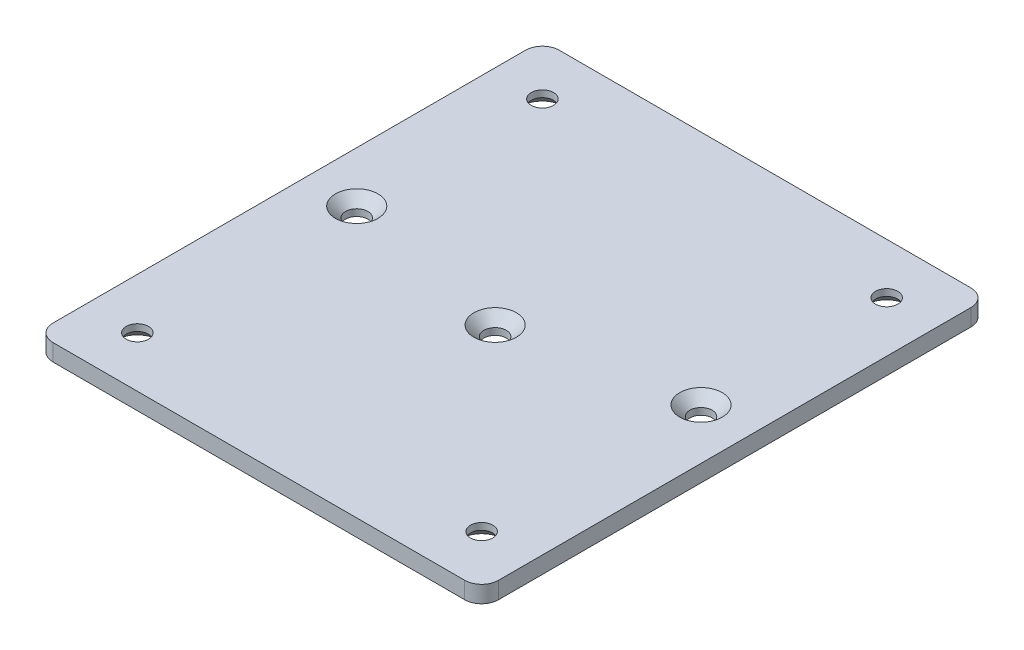
ISO-10303-21;
HEADER;
FILE_DESCRIPTION(('STEP AP214'),'2;1');
FILE_NAME('part.step','',(''),(''),'','','');
FILE_SCHEMA(('AUTOMOTIVE_DESIGN { 1 0 10303 214 1 1 1 1 }'));
ENDSEC;
DATA;
#1=APPLICATION_CONTEXT('core data for automotive mechanical design processes');
#2=APPLICATION_PROTOCOL_DEFINITION('international standard','automotive_design',2000,#1);
#3=PRODUCT_CONTEXT('',#1,'mechanical');
#4=PRODUCT('Part','Part','',(#3));
#5=PRODUCT_RELATED_PRODUCT_CATEGORY('part','',(#4));
#6=PRODUCT_DEFINITION_FORMATION('','',#4);
#7=PRODUCT_DEFINITION_CONTEXT('part definition',#1,'design');
#8=PRODUCT_DEFINITION('design','',#6,#7);
#9=PRODUCT_DEFINITION_SHAPE('','',#8);
#10=(LENGTH_UNIT() NAMED_UNIT(*) SI_UNIT(.MILLI.,.METRE.));
#11=(NAMED_UNIT(*) PLANE_ANGLE_UNIT() SI_UNIT($,.RADIAN.));
#12=(NAMED_UNIT(*) SI_UNIT($,.STERADIAN.) SOLID_ANGLE_UNIT());
#13=UNCERTAINTY_MEASURE_WITH_UNIT(LENGTH_MEASURE(1.E-05),#10,'distance_accuracy_value','');
#14=(GEOMETRIC_REPRESENTATION_CONTEXT(3) GLOBAL_UNCERTAINTY_ASSIGNED_CONTEXT((#13)) GLOBAL_UNIT_ASSIGNED_CONTEXT((#10,
#11,#12)) REPRESENTATION_CONTEXT('',''));
#15=CARTESIAN_POINT('',(0.,0.,0.));
#16=DIRECTION('',(0.,0.,1.));
#17=DIRECTION('',(1.,0.,0.));
#18=AXIS2_PLACEMENT_3D('',#15,#16,#17);
#19=CARTESIAN_POINT('',(0.,5.,0.));
#20=DIRECTION('',(1.,0.,0.));
#21=DIRECTION('',(0.,0.,-1.));
#22=AXIS2_PLACEMENT_3D('',#19,#20,#21);
#23=PLANE('',#22);
#24=DIRECTION('',(0.,0.,1.));
#25=VECTOR('',#24,1.);
#26=CARTESIAN_POINT('',(0.,0.,0.));
#27=LINE('',#26,#25);
#28=CARTESIAN_POINT('',(0.,0.,-145.));
#29=VERTEX_POINT('',#28);
#30=CARTESIAN_POINT('',(0.,0.,-5.));
#31=VERTEX_POINT('',#30);
#32=EDGE_CURVE('E138',#29,#31,#27,.T.);
#33=ORIENTED_EDGE('',*,*,#32,.T.);
#34=DIRECTION('',(0.,-1.,0.));
#35=VECTOR('',#34,1.);
#36=CARTESIAN_POINT('',(0.,5.,-5.));
#37=LINE('',#36,#35);
#38=CARTESIAN_POINT('',(0.,5.,-5.));
#39=VERTEX_POINT('',#38);
#40=EDGE_CURVE('E11',#31,#39,#37,.F.);
#41=ORIENTED_EDGE('',*,*,#40,.T.);
#42=DIRECTION('',(0.,0.,1.));
#43=VECTOR('',#42,1.);
#44=CARTESIAN_POINT('',(0.,5.,0.));
#45=LINE('',#44,#43);
#46=CARTESIAN_POINT('',(0.,5.,-145.));
#47=VERTEX_POINT('',#46);
#48=EDGE_CURVE('E126',#47,#39,#45,.T.);
#49=ORIENTED_EDGE('',*,*,#48,.F.);
#50=DIRECTION('',(0.,-1.,0.));
#51=VECTOR('',#50,1.);
#52=CARTESIAN_POINT('',(0.,5.,-145.));
#53=LINE('',#52,#51);
#54=EDGE_CURVE('E42',#47,#29,#53,.T.);
#55=ORIENTED_EDGE('',*,*,#54,.T.);
#56=EDGE_LOOP('',(#33,#41,#49,#55));
#57=FACE_BOUND('',#56,.T.);
#58=ADVANCED_FACE('F34',(#57),#23,.F.);
#59=CARTESIAN_POINT('',(0.,5.,0.));
#60=DIRECTION('',(0.,0.,-1.));
#61=DIRECTION('',(-1.,0.,0.));
#62=AXIS2_PLACEMENT_3D('',#59,#60,#61);
#63=PLANE('',#62);
#64=DIRECTION('',(1.,0.,0.));
#65=VECTOR('',#64,1.);
#66=CARTESIAN_POINT('',(0.,0.,0.));
#67=LINE('',#66,#65);
#68=CARTESIAN_POINT('',(5.,0.,0.));
#69=VERTEX_POINT('',#68);
#70=CARTESIAN_POINT('',(127.,0.,0.));
#71=VERTEX_POINT('',#70);
#72=EDGE_CURVE('E131',#69,#71,#67,.T.);
#73=ORIENTED_EDGE('',*,*,#72,.T.);
#74=DIRECTION('',(0.,-1.,0.));
#75=VECTOR('',#74,1.);
#76=CARTESIAN_POINT('',(127.,5.,0.));
#77=LINE('',#76,#75);
#78=CARTESIAN_POINT('',(127.,5.,0.));
#79=VERTEX_POINT('',#78);
#80=EDGE_CURVE('E49',#71,#79,#77,.F.);
#81=ORIENTED_EDGE('',*,*,#80,.T.);
#82=DIRECTION('',(1.,0.,0.));
#83=VECTOR('',#82,1.);
#84=CARTESIAN_POINT('',(0.,5.,0.));
#85=LINE('',#84,#83);
#86=CARTESIAN_POINT('',(5.,5.,0.));
#87=VERTEX_POINT('',#86);
#88=EDGE_CURVE('E129',#87,#79,#85,.T.);
#89=ORIENTED_EDGE('',*,*,#88,.F.);
#90=DIRECTION('',(0.,-1.,0.));
#91=VECTOR('',#90,1.);
#92=CARTESIAN_POINT('',(5.,5.,0.));
#93=LINE('',#92,#91);
#94=EDGE_CURVE('E185',#87,#69,#93,.T.);
#95=ORIENTED_EDGE('',*,*,#94,.T.);
#96=EDGE_LOOP('',(#73,#81,#89,#95));
#97=FACE_BOUND('',#96,.T.);
#98=ADVANCED_FACE('F275',(#97),#63,.F.);
#99=CARTESIAN_POINT('',(132.,5.,0.));
#100=DIRECTION('',(-1.,0.,0.));
#101=DIRECTION('',(0.,0.,1.));
#102=AXIS2_PLACEMENT_3D('',#99,#100,#101);
#103=PLANE('',#102);
#104=DIRECTION('',(0.,0.,-1.));
#105=VECTOR('',#104,1.);
#106=CARTESIAN_POINT('',(132.,0.,0.));
#107=LINE('',#106,#105);
#108=CARTESIAN_POINT('',(132.,0.,-5.));
#109=VERTEX_POINT('',#108);
#110=CARTESIAN_POINT('',(132.,0.,-145.));
#111=VERTEX_POINT('',#110);
#112=EDGE_CURVE('E127',#109,#111,#107,.T.);
#113=ORIENTED_EDGE('',*,*,#112,.T.);
#114=DIRECTION('',(0.,-1.,0.));
#115=VECTOR('',#114,1.);
#116=CARTESIAN_POINT('',(132.,5.,-145.));
#117=LINE('',#116,#115);
#118=CARTESIAN_POINT('',(132.,5.,-145.));
#119=VERTEX_POINT('',#118);
#120=EDGE_CURVE('E105',#111,#119,#117,.F.);
#121=ORIENTED_EDGE('',*,*,#120,.T.);
#122=DIRECTION('',(0.,0.,-1.));
#123=VECTOR('',#122,1.);
#124=CARTESIAN_POINT('',(132.,5.,0.));
#125=LINE('',#124,#123);
#126=CARTESIAN_POINT('',(132.,5.,-5.));
#127=VERTEX_POINT('',#126);
#128=EDGE_CURVE('E200',#127,#119,#125,.T.);
#129=ORIENTED_EDGE('',*,*,#128,.F.);
#130=DIRECTION('',(0.,-1.,0.));
#131=VECTOR('',#130,1.);
#132=CARTESIAN_POINT('',(132.,5.,-5.));
#133=LINE('',#132,#131);
#134=EDGE_CURVE('E110',#127,#109,#133,.T.);
#135=ORIENTED_EDGE('',*,*,#134,.T.);
#136=EDGE_LOOP('',(#113,#121,#129,#135));
#137=FACE_BOUND('',#136,.T.);
#138=ADVANCED_FACE('F272',(#137),#103,.F.);
#139=CARTESIAN_POINT('',(0.,5.,-150.));
#140=DIRECTION('',(0.,0.,1.));
#141=DIRECTION('',(1.,0.,0.));
#142=AXIS2_PLACEMENT_3D('',#139,#140,#141);
#143=PLANE('',#142);
#144=DIRECTION('',(-1.,0.,0.));
#145=VECTOR('',#144,1.);
#146=CARTESIAN_POINT('',(0.,5.,-150.));
#147=LINE('',#146,#145);
#148=CARTESIAN_POINT('',(127.,5.,-150.));
#149=VERTEX_POINT('',#148);
#150=CARTESIAN_POINT('',(5.,5.,-150.));
#151=VERTEX_POINT('',#150);
#152=EDGE_CURVE('E120',#149,#151,#147,.T.);
#153=ORIENTED_EDGE('',*,*,#152,.F.);
#154=DIRECTION('',(0.,-1.,0.));
#155=VECTOR('',#154,1.);
#156=CARTESIAN_POINT('',(127.,5.,-150.));
#157=LINE('',#156,#155);
#158=CARTESIAN_POINT('',(127.,0.,-150.));
#159=VERTEX_POINT('',#158);
#160=EDGE_CURVE('E104',#149,#159,#157,.T.);
#161=ORIENTED_EDGE('',*,*,#160,.T.);
#162=DIRECTION('',(-1.,0.,0.));
#163=VECTOR('',#162,1.);
#164=CARTESIAN_POINT('',(0.,0.,-150.));
#165=LINE('',#164,#163);
#166=CARTESIAN_POINT('',(5.,0.,-150.));
#167=VERTEX_POINT('',#166);
#168=EDGE_CURVE('E117',#159,#167,#165,.T.);
#169=ORIENTED_EDGE('',*,*,#168,.T.);
#170=DIRECTION('',(0.,-1.,0.));
#171=VECTOR('',#170,1.);
#172=CARTESIAN_POINT('',(5.,5.,-150.));
#173=LINE('',#172,#171);
#174=EDGE_CURVE('E122',#167,#151,#173,.F.);
#175=ORIENTED_EDGE('',*,*,#174,.T.);
#176=EDGE_LOOP('',(#153,#161,#169,#175));
#177=FACE_BOUND('',#176,.T.);
#178=ADVANCED_FACE('F116',(#177),#143,.F.);
#179=CARTESIAN_POINT('',(0.,5.,0.));
#180=DIRECTION('',(0.,-1.,0.));
#181=DIRECTION('',(0.,0.,-1.));
#182=AXIS2_PLACEMENT_3D('',#179,#180,#181);
#183=PLANE('',#182);
#184=CARTESIAN_POINT('',(15.,5.,-15.));
#185=DIRECTION('',(0.,-1.,0.));
#186=DIRECTION('',(0.,0.,-1.));
#187=AXIS2_PLACEMENT_3D('',#184,#185,#186);
#188=CIRCLE('',#187,3.29999999999999);
#189=CARTESIAN_POINT('',(15.,5.,-18.3));
#190=VERTEX_POINT('',#189);
#191=EDGE_CURVE('E165',#190,#190,#188,.T.);
#192=ORIENTED_EDGE('',*,*,#191,.T.);
#193=EDGE_LOOP('',(#192));
#194=FACE_BOUND('',#193,.T.);
#195=CARTESIAN_POINT('',(117.,5.,-15.));
#196=DIRECTION('',(0.,-1.,0.));
#197=DIRECTION('',(0.,0.,-1.));
#198=AXIS2_PLACEMENT_3D('',#195,#196,#197);
#199=CIRCLE('',#198,3.29999999999998);
#200=CARTESIAN_POINT('',(117.,5.,-18.3));
#201=VERTEX_POINT('',#200);
#202=EDGE_CURVE('E160',#201,#201,#199,.T.);
#203=ORIENTED_EDGE('',*,*,#202,.T.);
#204=EDGE_LOOP('',(#203));
#205=FACE_BOUND('',#204,.T.);
#206=CARTESIAN_POINT('',(117.,5.,-135.));
#207=DIRECTION('',(0.,-1.,0.));
#208=DIRECTION('',(0.,0.,-1.));
#209=AXIS2_PLACEMENT_3D('',#206,#207,#208);
#210=CIRCLE('',#209,3.29999999999998);
#211=CARTESIAN_POINT('',(117.,5.,-138.3));
#212=VERTEX_POINT('',#211);
#213=EDGE_CURVE('E155',#212,#212,#210,.T.);
#214=ORIENTED_EDGE('',*,*,#213,.T.);
#215=EDGE_LOOP('',(#214));
#216=FACE_BOUND('',#215,.T.);
#217=CARTESIAN_POINT('',(15.,5.,-135.));
#218=DIRECTION('',(0.,-1.,0.));
#219=DIRECTION('',(0.,0.,-1.));
#220=AXIS2_PLACEMENT_3D('',#217,#218,#219);
#221=CIRCLE('',#220,3.29999999999999);
#222=CARTESIAN_POINT('',(15.,5.,-138.3));
#223=VERTEX_POINT('',#222);
#224=EDGE_CURVE('E150',#223,#223,#221,.T.);
#225=ORIENTED_EDGE('',*,*,#224,.T.);
#226=EDGE_LOOP('',(#225));
#227=FACE_BOUND('',#226,.T.);
#228=CARTESIAN_POINT('',(15.,5.,-80.));
#229=DIRECTION('',(0.,1.,0.));
#230=DIRECTION('',(0.,0.,1.));
#231=AXIS2_PLACEMENT_3D('',#228,#229,#230);
#232=CIRCLE('',#231,6.3);
#233=CARTESIAN_POINT('',(15.,5.,-73.7));
#234=VERTEX_POINT('',#233);
#235=EDGE_CURVE('E153',#234,#234,#232,.T.);
#236=ORIENTED_EDGE('',*,*,#235,.F.);
#237=EDGE_LOOP('',(#236));
#238=FACE_BOUND('',#237,.T.);
#239=CARTESIAN_POINT('',(66.,5.,-70.));
#240=DIRECTION('',(0.,1.,0.));
#241=DIRECTION('',(0.,0.,1.));
#242=AXIS2_PLACEMENT_3D('',#239,#240,#241);
#243=CIRCLE('',#242,6.3);
#244=CARTESIAN_POINT('',(66.,5.,-63.7));
#245=VERTEX_POINT('',#244);
#246=EDGE_CURVE('E148',#245,#245,#243,.T.);
#247=ORIENTED_EDGE('',*,*,#246,.F.);
#248=EDGE_LOOP('',(#247));
#249=FACE_BOUND('',#248,.T.);
#250=CARTESIAN_POINT('',(117.,5.,-80.));
#251=DIRECTION('',(0.,1.,0.));
#252=DIRECTION('',(0.,0.,1.));
#253=AXIS2_PLACEMENT_3D('',#250,#251,#252);
#254=CIRCLE('',#253,6.3);
#255=CARTESIAN_POINT('',(117.,5.,-73.7));
#256=VERTEX_POINT('',#255);
#257=EDGE_CURVE('E143',#256,#256,#254,.T.);
#258=ORIENTED_EDGE('',*,*,#257,.F.);
#259=EDGE_LOOP('',(#258));
#260=FACE_BOUND('',#259,.T.);
#261=ORIENTED_EDGE('',*,*,#128,.T.);
#262=CARTESIAN_POINT('',(127.,5.,-145.));
#263=DIRECTION('',(0.,-1.,0.));
#264=DIRECTION('',(0.,0.,-1.));
#265=AXIS2_PLACEMENT_3D('',#262,#263,#264);
#266=CIRCLE('',#265,5.);
#267=EDGE_CURVE('E183',#119,#149,#266,.F.);
#268=ORIENTED_EDGE('',*,*,#267,.T.);
#269=ORIENTED_EDGE('',*,*,#152,.T.);
#270=CARTESIAN_POINT('',(5.,5.,-145.));
#271=DIRECTION('',(0.,-1.,0.));
#272=DIRECTION('',(0.,0.,-1.));
#273=AXIS2_PLACEMENT_3D('',#270,#271,#272);
#274=CIRCLE('',#273,5.);
#275=EDGE_CURVE('E178',#151,#47,#274,.F.);
#276=ORIENTED_EDGE('',*,*,#275,.T.);
#277=ORIENTED_EDGE('',*,*,#48,.T.);
#278=CARTESIAN_POINT('',(5.,5.,-5.));
#279=DIRECTION('',(0.,-1.,0.));
#280=DIRECTION('',(0.,0.,-1.));
#281=AXIS2_PLACEMENT_3D('',#278,#279,#280);
#282=CIRCLE('',#281,5.);
#283=EDGE_CURVE('E56',#39,#87,#282,.F.);
#284=ORIENTED_EDGE('',*,*,#283,.T.);
#285=ORIENTED_EDGE('',*,*,#88,.T.);
#286=CARTESIAN_POINT('',(127.,5.,-5.));
#287=DIRECTION('',(0.,-1.,0.));
#288=DIRECTION('',(0.,0.,-1.));
#289=AXIS2_PLACEMENT_3D('',#286,#287,#288);
#290=CIRCLE('',#289,5.);
#291=EDGE_CURVE('E181',#79,#127,#290,.F.);
#292=ORIENTED_EDGE('',*,*,#291,.T.);
#293=EDGE_LOOP('',(#261,#268,#269,#276,#277,#284,#285,#292));
#294=FACE_BOUND('',#293,.T.);
#295=ADVANCED_FACE('F239',(#194,#205,#216,#227,#238,#249,#260,#294),#183,.F.);
#296=CARTESIAN_POINT('',(0.,0.,0.));
#297=DIRECTION('',(0.,-1.,0.));
#298=DIRECTION('',(0.,0.,-1.));
#299=AXIS2_PLACEMENT_3D('',#296,#297,#298);
#300=PLANE('',#299);
#301=CARTESIAN_POINT('',(15.,0.,-15.));
#302=DIRECTION('',(0.,-1.,0.));
#303=DIRECTION('',(0.,0.,-1.));
#304=AXIS2_PLACEMENT_3D('',#301,#302,#303);
#305=CIRCLE('',#304,6.3);
#306=CARTESIAN_POINT('',(15.,0.,-21.3));
#307=VERTEX_POINT('',#306);
#308=EDGE_CURVE('E230',#307,#307,#305,.T.);
#309=ORIENTED_EDGE('',*,*,#308,.F.);
#310=EDGE_LOOP('',(#309));
#311=FACE_BOUND('',#310,.T.);
#312=CARTESIAN_POINT('',(117.,0.,-15.));
#313=DIRECTION('',(0.,-1.,0.));
#314=DIRECTION('',(0.,0.,-1.));
#315=AXIS2_PLACEMENT_3D('',#312,#313,#314);
#316=CIRCLE('',#315,6.3);
#317=CARTESIAN_POINT('',(117.,0.,-21.3));
#318=VERTEX_POINT('',#317);
#319=EDGE_CURVE('E168',#318,#318,#316,.T.);
#320=ORIENTED_EDGE('',*,*,#319,.F.);
#321=EDGE_LOOP('',(#320));
#322=FACE_BOUND('',#321,.T.);
#323=CARTESIAN_POINT('',(117.,0.,-135.));
#324=DIRECTION('',(0.,-1.,0.));
#325=DIRECTION('',(0.,0.,-1.));
#326=AXIS2_PLACEMENT_3D('',#323,#324,#325);
#327=CIRCLE('',#326,6.3);
#328=CARTESIAN_POINT('',(117.,0.,-141.3));
#329=VERTEX_POINT('',#328);
#330=EDGE_CURVE('E163',#329,#329,#327,.T.);
#331=ORIENTED_EDGE('',*,*,#330,.F.);
#332=EDGE_LOOP('',(#331));
#333=FACE_BOUND('',#332,.T.);
#334=CARTESIAN_POINT('',(15.,0.,-135.));
#335=DIRECTION('',(0.,-1.,0.));
#336=DIRECTION('',(0.,0.,-1.));
#337=AXIS2_PLACEMENT_3D('',#334,#335,#336);
#338=CIRCLE('',#337,6.3);
#339=CARTESIAN_POINT('',(15.,0.,-141.3));
#340=VERTEX_POINT('',#339);
#341=EDGE_CURVE('E158',#340,#340,#338,.T.);
#342=ORIENTED_EDGE('',*,*,#341,.F.);
#343=EDGE_LOOP('',(#342));
#344=FACE_BOUND('',#343,.T.);
#345=CARTESIAN_POINT('',(15.,0.,-80.));
#346=DIRECTION('',(0.,-1.,0.));
#347=DIRECTION('',(0.,0.,-1.));
#348=AXIS2_PLACEMENT_3D('',#345,#346,#347);
#349=CIRCLE('',#348,3.29999999999999);
#350=CARTESIAN_POINT('',(15.,0.,-83.3));
#351=VERTEX_POINT('',#350);
#352=EDGE_CURVE('E145',#351,#351,#349,.T.);
#353=ORIENTED_EDGE('',*,*,#352,.F.);
#354=EDGE_LOOP('',(#353));
#355=FACE_BOUND('',#354,.T.);
#356=CARTESIAN_POINT('',(66.,0.,-70.));
#357=DIRECTION('',(0.,-1.,0.));
#358=DIRECTION('',(0.,0.,-1.));
#359=AXIS2_PLACEMENT_3D('',#356,#357,#358);
#360=CIRCLE('',#359,3.29999999999999);
#361=CARTESIAN_POINT('',(66.,0.,-73.3));
#362=VERTEX_POINT('',#361);
#363=EDGE_CURVE('E140',#362,#362,#360,.T.);
#364=ORIENTED_EDGE('',*,*,#363,.F.);
#365=EDGE_LOOP('',(#364));
#366=FACE_BOUND('',#365,.T.);
#367=CARTESIAN_POINT('',(117.,0.,-80.));
#368=DIRECTION('',(0.,-1.,0.));
#369=DIRECTION('',(0.,0.,-1.));
#370=AXIS2_PLACEMENT_3D('',#367,#368,#369);
#371=CIRCLE('',#370,3.29999999999999);
#372=CARTESIAN_POINT('',(117.,0.,-83.3));
#373=VERTEX_POINT('',#372);
#374=EDGE_CURVE('E135',#373,#373,#371,.T.);
#375=ORIENTED_EDGE('',*,*,#374,.F.);
#376=EDGE_LOOP('',(#375));
#377=FACE_BOUND('',#376,.T.);
#378=ORIENTED_EDGE('',*,*,#168,.F.);
#379=CARTESIAN_POINT('',(127.,0.,-145.));
#380=DIRECTION('',(0.,-1.,0.));
#381=DIRECTION('',(0.,0.,-1.));
#382=AXIS2_PLACEMENT_3D('',#379,#380,#381);
#383=CIRCLE('',#382,5.);
#384=EDGE_CURVE('E100',#159,#111,#383,.T.);
#385=ORIENTED_EDGE('',*,*,#384,.T.);
#386=ORIENTED_EDGE('',*,*,#112,.F.);
#387=CARTESIAN_POINT('',(127.,0.,-5.));
#388=DIRECTION('',(0.,-1.,0.));
#389=DIRECTION('',(0.,0.,-1.));
#390=AXIS2_PLACEMENT_3D('',#387,#388,#389);
#391=CIRCLE('',#390,5.);
#392=EDGE_CURVE('E111',#109,#71,#391,.T.);
#393=ORIENTED_EDGE('',*,*,#392,.T.);
#394=ORIENTED_EDGE('',*,*,#72,.F.);
#395=CARTESIAN_POINT('',(5.,0.,-5.));
#396=DIRECTION('',(0.,-1.,0.));
#397=DIRECTION('',(0.,0.,-1.));
#398=AXIS2_PLACEMENT_3D('',#395,#396,#397);
#399=CIRCLE('',#398,5.);
#400=EDGE_CURVE('E172',#69,#31,#399,.T.);
#401=ORIENTED_EDGE('',*,*,#400,.T.);
#402=ORIENTED_EDGE('',*,*,#32,.F.);
#403=CARTESIAN_POINT('',(5.,0.,-145.));
#404=DIRECTION('',(0.,-1.,0.));
#405=DIRECTION('',(0.,0.,-1.));
#406=AXIS2_PLACEMENT_3D('',#403,#404,#405);
#407=CIRCLE('',#406,5.);
#408=EDGE_CURVE('E121',#29,#167,#407,.T.);
#409=ORIENTED_EDGE('',*,*,#408,.T.);
#410=EDGE_LOOP('',(#378,#385,#386,#393,#394,#401,#402,#409));
#411=FACE_BOUND('',#410,.T.);
#412=ADVANCED_FACE('F124',(#311,#322,#333,#344,#355,#366,#377,#411),#300,.T.);
#413=CARTESIAN_POINT('',(117.,5.,-80.));
#414=DIRECTION('',(0.,1.,0.));
#415=DIRECTION('',(0.,0.,1.));
#416=AXIS2_PLACEMENT_3D('',#413,#414,#415);
#417=CYLINDRICAL_SURFACE('',#416,3.29999999999999);
#418=ORIENTED_EDGE('',*,*,#374,.T.);
#419=EDGE_LOOP('',(#418));
#420=FACE_BOUND('',#419,.T.);
#421=CARTESIAN_POINT('',(117.,2.,-80.));
#422=DIRECTION('',(0.,1.,0.));
#423=DIRECTION('',(0.,0.,1.));
#424=AXIS2_PLACEMENT_3D('',#421,#422,#423);
#425=CIRCLE('',#424,3.3);
#426=CARTESIAN_POINT('',(117.,2.,-76.7));
#427=VERTEX_POINT('',#426);
#428=EDGE_CURVE('E139',#427,#427,#425,.T.);
#429=ORIENTED_EDGE('',*,*,#428,.T.);
#430=EDGE_LOOP('',(#429));
#431=FACE_BOUND('',#430,.T.);
#432=ADVANCED_FACE('F238',(#420,#431),#417,.F.);
#433=CARTESIAN_POINT('',(117.,5.,-80.));
#434=DIRECTION('',(0.,1.,0.));
#435=DIRECTION('',(0.,0.,1.));
#436=AXIS2_PLACEMENT_3D('',#433,#434,#435);
#437=CONICAL_SURFACE('',#436,6.3,0.785398163397448);
#438=ORIENTED_EDGE('',*,*,#428,.F.);
#439=EDGE_LOOP('',(#438));
#440=FACE_BOUND('',#439,.T.);
#441=ORIENTED_EDGE('',*,*,#257,.T.);
#442=EDGE_LOOP('',(#441));
#443=FACE_BOUND('',#442,.T.);
#444=ADVANCED_FACE('F255',(#440,#443),#437,.F.);
#445=CARTESIAN_POINT('',(66.,5.,-70.));
#446=DIRECTION('',(0.,1.,0.));
#447=DIRECTION('',(0.,0.,1.));
#448=AXIS2_PLACEMENT_3D('',#445,#446,#447);
#449=CYLINDRICAL_SURFACE('',#448,3.29999999999999);
#450=ORIENTED_EDGE('',*,*,#363,.T.);
#451=EDGE_LOOP('',(#450));
#452=FACE_BOUND('',#451,.T.);
#453=CARTESIAN_POINT('',(66.,2.,-70.));
#454=DIRECTION('',(0.,1.,0.));
#455=DIRECTION('',(0.,0.,1.));
#456=AXIS2_PLACEMENT_3D('',#453,#454,#455);
#457=CIRCLE('',#456,3.3);
#458=CARTESIAN_POINT('',(66.,2.,-66.7));
#459=VERTEX_POINT('',#458);
#460=EDGE_CURVE('E144',#459,#459,#457,.T.);
#461=ORIENTED_EDGE('',*,*,#460,.T.);
#462=EDGE_LOOP('',(#461));
#463=FACE_BOUND('',#462,.T.);
#464=ADVANCED_FACE('F261',(#452,#463),#449,.F.);
#465=CARTESIAN_POINT('',(66.,5.,-70.));
#466=DIRECTION('',(0.,1.,0.));
#467=DIRECTION('',(0.,0.,1.));
#468=AXIS2_PLACEMENT_3D('',#465,#466,#467);
#469=CONICAL_SURFACE('',#468,6.3,0.785398163397448);
#470=ORIENTED_EDGE('',*,*,#460,.F.);
#471=EDGE_LOOP('',(#470));
#472=FACE_BOUND('',#471,.T.);
#473=ORIENTED_EDGE('',*,*,#246,.T.);
#474=EDGE_LOOP('',(#473));
#475=FACE_BOUND('',#474,.T.);
#476=ADVANCED_FACE('F404',(#472,#475),#469,.F.);
#477=CARTESIAN_POINT('',(15.,5.,-80.));
#478=DIRECTION('',(0.,1.,0.));
#479=DIRECTION('',(0.,0.,1.));
#480=AXIS2_PLACEMENT_3D('',#477,#478,#479);
#481=CYLINDRICAL_SURFACE('',#480,3.29999999999999);
#482=ORIENTED_EDGE('',*,*,#352,.T.);
#483=EDGE_LOOP('',(#482));
#484=FACE_BOUND('',#483,.T.);
#485=CARTESIAN_POINT('',(15.,2.,-80.));
#486=DIRECTION('',(0.,1.,0.));
#487=DIRECTION('',(0.,0.,1.));
#488=AXIS2_PLACEMENT_3D('',#485,#486,#487);
#489=CIRCLE('',#488,3.3);
#490=CARTESIAN_POINT('',(15.,2.,-76.7));
#491=VERTEX_POINT('',#490);
#492=EDGE_CURVE('E149',#491,#491,#489,.T.);
#493=ORIENTED_EDGE('',*,*,#492,.T.);
#494=EDGE_LOOP('',(#493));
#495=FACE_BOUND('',#494,.T.);
#496=ADVANCED_FACE('F395',(#484,#495),#481,.F.);
#497=CARTESIAN_POINT('',(15.,5.,-80.));
#498=DIRECTION('',(0.,1.,0.));
#499=DIRECTION('',(0.,0.,1.));
#500=AXIS2_PLACEMENT_3D('',#497,#498,#499);
#501=CONICAL_SURFACE('',#500,6.3,0.785398163397448);
#502=ORIENTED_EDGE('',*,*,#492,.F.);
#503=EDGE_LOOP('',(#502));
#504=FACE_BOUND('',#503,.T.);
#505=ORIENTED_EDGE('',*,*,#235,.T.);
#506=EDGE_LOOP('',(#505));
#507=FACE_BOUND('',#506,.T.);
#508=ADVANCED_FACE('F386',(#504,#507),#501,.F.);
#509=CARTESIAN_POINT('',(15.,0.,-135.));
#510=DIRECTION('',(0.,-1.,0.));
#511=DIRECTION('',(0.,0.,-1.));
#512=AXIS2_PLACEMENT_3D('',#509,#510,#511);
#513=CYLINDRICAL_SURFACE('',#512,3.29999999999999);
#514=CARTESIAN_POINT('',(15.,3.,-135.));
#515=DIRECTION('',(0.,-1.,0.));
#516=DIRECTION('',(0.,0.,-1.));
#517=AXIS2_PLACEMENT_3D('',#514,#515,#516);
#518=CIRCLE('',#517,3.29999999999999);
#519=CARTESIAN_POINT('',(15.,3.,-138.3));
#520=VERTEX_POINT('',#519);
#521=EDGE_CURVE('E154',#520,#520,#518,.T.);
#522=ORIENTED_EDGE('',*,*,#521,.T.);
#523=EDGE_LOOP('',(#522));
#524=FACE_BOUND('',#523,.T.);
#525=ORIENTED_EDGE('',*,*,#224,.F.);
#526=EDGE_LOOP('',(#525));
#527=FACE_BOUND('',#526,.T.);
#528=ADVANCED_FACE('F377',(#524,#527),#513,.F.);
#529=CARTESIAN_POINT('',(15.,0.,-135.));
#530=DIRECTION('',(0.,-1.,0.));
#531=DIRECTION('',(0.,0.,-1.));
#532=AXIS2_PLACEMENT_3D('',#529,#530,#531);
#533=CONICAL_SURFACE('',#532,6.3,0.78539816339745);
#534=ORIENTED_EDGE('',*,*,#521,.F.);
#535=EDGE_LOOP('',(#534));
#536=FACE_BOUND('',#535,.T.);
#537=ORIENTED_EDGE('',*,*,#341,.T.);
#538=EDGE_LOOP('',(#537));
#539=FACE_BOUND('',#538,.T.);
#540=ADVANCED_FACE('F368',(#536,#539),#533,.F.);
#541=CARTESIAN_POINT('',(117.,0.,-135.));
#542=DIRECTION('',(0.,-1.,0.));
#543=DIRECTION('',(0.,0.,-1.));
#544=AXIS2_PLACEMENT_3D('',#541,#542,#543);
#545=CYLINDRICAL_SURFACE('',#544,3.29999999999998);
#546=CARTESIAN_POINT('',(117.,3.,-135.));
#547=DIRECTION('',(0.,-1.,0.));
#548=DIRECTION('',(0.,0.,-1.));
#549=AXIS2_PLACEMENT_3D('',#546,#547,#548);
#550=CIRCLE('',#549,3.29999999999998);
#551=CARTESIAN_POINT('',(117.,3.,-138.3));
#552=VERTEX_POINT('',#551);
#553=EDGE_CURVE('E159',#552,#552,#550,.T.);
#554=ORIENTED_EDGE('',*,*,#553,.T.);
#555=EDGE_LOOP('',(#554));
#556=FACE_BOUND('',#555,.T.);
#557=ORIENTED_EDGE('',*,*,#213,.F.);
#558=EDGE_LOOP('',(#557));
#559=FACE_BOUND('',#558,.T.);
#560=ADVANCED_FACE('F359',(#556,#559),#545,.F.);
#561=CARTESIAN_POINT('',(117.,0.,-135.));
#562=DIRECTION('',(0.,-1.,0.));
#563=DIRECTION('',(0.,0.,-1.));
#564=AXIS2_PLACEMENT_3D('',#561,#562,#563);
#565=CONICAL_SURFACE('',#564,6.3,0.78539816339745);
#566=ORIENTED_EDGE('',*,*,#553,.F.);
#567=EDGE_LOOP('',(#566));
#568=FACE_BOUND('',#567,.T.);
#569=ORIENTED_EDGE('',*,*,#330,.T.);
#570=EDGE_LOOP('',(#569));
#571=FACE_BOUND('',#570,.T.);
#572=ADVANCED_FACE('F350',(#568,#571),#565,.F.);
#573=CARTESIAN_POINT('',(117.,0.,-15.));
#574=DIRECTION('',(0.,-1.,0.));
#575=DIRECTION('',(0.,0.,-1.));
#576=AXIS2_PLACEMENT_3D('',#573,#574,#575);
#577=CYLINDRICAL_SURFACE('',#576,3.29999999999998);
#578=CARTESIAN_POINT('',(117.,3.,-15.));
#579=DIRECTION('',(0.,-1.,0.));
#580=DIRECTION('',(0.,0.,-1.));
#581=AXIS2_PLACEMENT_3D('',#578,#579,#580);
#582=CIRCLE('',#581,3.29999999999998);
#583=CARTESIAN_POINT('',(117.,3.,-18.3));
#584=VERTEX_POINT('',#583);
#585=EDGE_CURVE('E164',#584,#584,#582,.T.);
#586=ORIENTED_EDGE('',*,*,#585,.T.);
#587=EDGE_LOOP('',(#586));
#588=FACE_BOUND('',#587,.T.);
#589=ORIENTED_EDGE('',*,*,#202,.F.);
#590=EDGE_LOOP('',(#589));
#591=FACE_BOUND('',#590,.T.);
#592=ADVANCED_FACE('F341',(#588,#591),#577,.F.);
#593=CARTESIAN_POINT('',(117.,0.,-15.));
#594=DIRECTION('',(0.,-1.,0.));
#595=DIRECTION('',(0.,0.,-1.));
#596=AXIS2_PLACEMENT_3D('',#593,#594,#595);
#597=CONICAL_SURFACE('',#596,6.3,0.78539816339745);
#598=ORIENTED_EDGE('',*,*,#585,.F.);
#599=EDGE_LOOP('',(#598));
#600=FACE_BOUND('',#599,.T.);
#601=ORIENTED_EDGE('',*,*,#319,.T.);
#602=EDGE_LOOP('',(#601));
#603=FACE_BOUND('',#602,.T.);
#604=ADVANCED_FACE('F332',(#600,#603),#597,.F.);
#605=CARTESIAN_POINT('',(15.,0.,-15.));
#606=DIRECTION('',(0.,-1.,0.));
#607=DIRECTION('',(0.,0.,-1.));
#608=AXIS2_PLACEMENT_3D('',#605,#606,#607);
#609=CYLINDRICAL_SURFACE('',#608,3.29999999999999);
#610=CARTESIAN_POINT('',(15.,3.,-15.));
#611=DIRECTION('',(0.,-1.,0.));
#612=DIRECTION('',(0.,0.,-1.));
#613=AXIS2_PLACEMENT_3D('',#610,#611,#612);
#614=CIRCLE('',#613,3.29999999999999);
#615=CARTESIAN_POINT('',(15.,3.,-18.3));
#616=VERTEX_POINT('',#615);
#617=EDGE_CURVE('E169',#616,#616,#614,.T.);
#618=ORIENTED_EDGE('',*,*,#617,.T.);
#619=EDGE_LOOP('',(#618));
#620=FACE_BOUND('',#619,.T.);
#621=ORIENTED_EDGE('',*,*,#191,.F.);
#622=EDGE_LOOP('',(#621));
#623=FACE_BOUND('',#622,.T.);
#624=ADVANCED_FACE('F323',(#620,#623),#609,.F.);
#625=CARTESIAN_POINT('',(15.,0.,-15.));
#626=DIRECTION('',(0.,-1.,0.));
#627=DIRECTION('',(0.,0.,-1.));
#628=AXIS2_PLACEMENT_3D('',#625,#626,#627);
#629=CONICAL_SURFACE('',#628,6.3,0.78539816339745);
#630=ORIENTED_EDGE('',*,*,#617,.F.);
#631=EDGE_LOOP('',(#630));
#632=FACE_BOUND('',#631,.T.);
#633=ORIENTED_EDGE('',*,*,#308,.T.);
#634=EDGE_LOOP('',(#633));
#635=FACE_BOUND('',#634,.T.);
#636=ADVANCED_FACE('F234',(#632,#635),#629,.F.);
#637=CARTESIAN_POINT('',(127.,5.,-145.));
#638=DIRECTION('',(0.,-1.,0.));
#639=DIRECTION('',(0.,0.,-1.));
#640=AXIS2_PLACEMENT_3D('',#637,#638,#639);
#641=CYLINDRICAL_SURFACE('',#640,5.);
#642=ORIENTED_EDGE('',*,*,#267,.F.);
#643=ORIENTED_EDGE('',*,*,#120,.F.);
#644=ORIENTED_EDGE('',*,*,#384,.F.);
#645=ORIENTED_EDGE('',*,*,#160,.F.);
#646=EDGE_LOOP('',(#642,#643,#644,#645));
#647=FACE_BOUND('',#646,.T.);
#648=ADVANCED_FACE('F103',(#647),#641,.T.);
#649=CARTESIAN_POINT('',(127.,5.,-5.));
#650=DIRECTION('',(0.,-1.,0.));
#651=DIRECTION('',(0.,0.,-1.));
#652=AXIS2_PLACEMENT_3D('',#649,#650,#651);
#653=CYLINDRICAL_SURFACE('',#652,5.);
#654=ORIENTED_EDGE('',*,*,#291,.F.);
#655=ORIENTED_EDGE('',*,*,#80,.F.);
#656=ORIENTED_EDGE('',*,*,#392,.F.);
#657=ORIENTED_EDGE('',*,*,#134,.F.);
#658=EDGE_LOOP('',(#654,#655,#656,#657));
#659=FACE_BOUND('',#658,.T.);
#660=ADVANCED_FACE('F274',(#659),#653,.T.);
#661=CARTESIAN_POINT('',(5.,5.,-5.));
#662=DIRECTION('',(0.,-1.,0.));
#663=DIRECTION('',(0.,0.,-1.));
#664=AXIS2_PLACEMENT_3D('',#661,#662,#663);
#665=CYLINDRICAL_SURFACE('',#664,5.);
#666=ORIENTED_EDGE('',*,*,#283,.F.);
#667=ORIENTED_EDGE('',*,*,#40,.F.);
#668=ORIENTED_EDGE('',*,*,#400,.F.);
#669=ORIENTED_EDGE('',*,*,#94,.F.);
#670=EDGE_LOOP('',(#666,#667,#668,#669));
#671=FACE_BOUND('',#670,.T.);
#672=ADVANCED_FACE('F278',(#671),#665,.T.);
#673=CARTESIAN_POINT('',(5.,5.,-145.));
#674=DIRECTION('',(0.,-1.,0.));
#675=DIRECTION('',(0.,0.,-1.));
#676=AXIS2_PLACEMENT_3D('',#673,#674,#675);
#677=CYLINDRICAL_SURFACE('',#676,5.);
#678=ORIENTED_EDGE('',*,*,#275,.F.);
#679=ORIENTED_EDGE('',*,*,#174,.F.);
#680=ORIENTED_EDGE('',*,*,#408,.F.);
#681=ORIENTED_EDGE('',*,*,#54,.F.);
#682=EDGE_LOOP('',(#678,#679,#680,#681));
#683=FACE_BOUND('',#682,.T.);
#684=ADVANCED_FACE('F36',(#683),#677,.T.);
#685=CLOSED_SHELL('',(#58,#98,#138,#178,#295,#412,#432,#444,#464,#476,#496,#508,#528,#540,#560,
#572,#592,#604,#624,#636,#648,#660,#672,#684));
#686=MANIFOLD_SOLID_BREP('B2',#685);
#687=ADVANCED_BREP_SHAPE_REPRESENTATION('',(#18,#686),#14);
#688=SHAPE_DEFINITION_REPRESENTATION(#9,#687);
ENDSEC;
END-ISO-10303-21;
